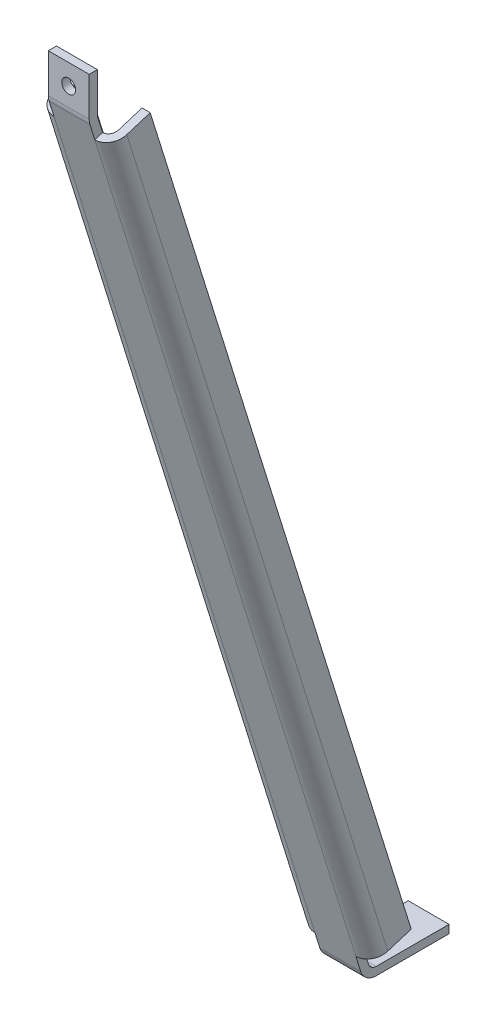
ISO-10303-21;
HEADER;
FILE_DESCRIPTION(('STEP AP214'),'2;1');
FILE_NAME('part.step','',(''),(''),'','','');
FILE_SCHEMA(('AUTOMOTIVE_DESIGN { 1 0 10303 214 1 1 1 1 }'));
ENDSEC;
DATA;
#1=APPLICATION_CONTEXT('core data for automotive mechanical design processes');
#2=APPLICATION_PROTOCOL_DEFINITION('international standard','automotive_design',2000,#1);
#3=PRODUCT_CONTEXT('',#1,'mechanical');
#4=PRODUCT('Part','Part','',(#3));
#5=PRODUCT_RELATED_PRODUCT_CATEGORY('part','',(#4));
#6=PRODUCT_DEFINITION_FORMATION('','',#4);
#7=PRODUCT_DEFINITION_CONTEXT('part definition',#1,'design');
#8=PRODUCT_DEFINITION('design','',#6,#7);
#9=PRODUCT_DEFINITION_SHAPE('','',#8);
#10=(LENGTH_UNIT() NAMED_UNIT(*) SI_UNIT(.MILLI.,.METRE.));
#11=(NAMED_UNIT(*) PLANE_ANGLE_UNIT() SI_UNIT($,.RADIAN.));
#12=(NAMED_UNIT(*) SI_UNIT($,.STERADIAN.) SOLID_ANGLE_UNIT());
#13=UNCERTAINTY_MEASURE_WITH_UNIT(LENGTH_MEASURE(1.E-05),#10,'distance_accuracy_value','');
#14=(GEOMETRIC_REPRESENTATION_CONTEXT(3) GLOBAL_UNCERTAINTY_ASSIGNED_CONTEXT((#13)) GLOBAL_UNIT_ASSIGNED_CONTEXT((#10,
#11,#12)) REPRESENTATION_CONTEXT('',''));
#15=CARTESIAN_POINT('',(0.,0.,0.));
#16=DIRECTION('',(0.,0.,1.));
#17=DIRECTION('',(1.,0.,0.));
#18=AXIS2_PLACEMENT_3D('',#15,#16,#17);
#19=CARTESIAN_POINT('',(195.,68.,39.7925903591226));
#20=DIRECTION('',(1.,0.,0.));
#21=DIRECTION('',(0.,0.,-1.));
#22=AXIS2_PLACEMENT_3D('',#19,#20,#21);
#23=PLANE('',#22);
#24=DIRECTION('',(0.,-0.954716716288455,-0.297516372052681));
#25=VECTOR('',#24,1.);
#26=CARTESIAN_POINT('',(195.,66.8099345117893,43.6114572242764));
#27=LINE('',#26,#25);
#28=CARTESIAN_POINT('',(195.,279.266547538485,109.818866865154));
#29=VERTEX_POINT('',#28);
#30=CARTESIAN_POINT('',(195.,275.447680673332,108.628801376943));
#31=VERTEX_POINT('',#30);
#32=EDGE_CURVE('E324',#29,#31,#27,.T.);
#33=ORIENTED_EDGE('',*,*,#32,.T.);
#34=DIRECTION('',(0.,0.297516372052681,-0.954716716288455));
#35=VECTOR('',#34,1.);
#36=CARTESIAN_POINT('',(195.,276.637746161542,104.809934511789));
#37=LINE('',#36,#35);
#38=CARTESIAN_POINT('',(195.,276.042713417437,106.719367944366));
#39=VERTEX_POINT('',#38);
#40=EDGE_CURVE('E11',#31,#39,#37,.T.);
#41=ORIENTED_EDGE('',*,*,#40,.T.);
#42=DIRECTION('',(0.,0.954716716288455,0.297516372052681));
#43=VECTOR('',#42,1.);
#44=CARTESIAN_POINT('',(195.,279.861580282591,107.909433432577));
#45=LINE('',#44,#43);
#46=CARTESIAN_POINT('',(195.,279.861580282591,107.909433432577));
#47=VERTEX_POINT('',#46);
#48=EDGE_CURVE('E313',#39,#47,#45,.T.);
#49=ORIENTED_EDGE('',*,*,#48,.T.);
#50=CARTESIAN_POINT('',(195.,280.456613026696,106.));
#51=DIRECTION('',(-1.,0.,0.));
#52=DIRECTION('',(0.,0.,-1.));
#53=AXIS2_PLACEMENT_3D('',#50,#51,#52);
#54=CIRCLE('',#53,1.99999999999999);
#55=CARTESIAN_POINT('',(195.,280.456613026696,108.));
#56=VERTEX_POINT('',#55);
#57=EDGE_CURVE('E314',#47,#56,#54,.T.);
#58=ORIENTED_EDGE('',*,*,#57,.T.);
#59=DIRECTION('',(0.,1.,0.));
#60=VECTOR('',#59,1.);
#61=CARTESIAN_POINT('',(195.,290.,108.));
#62=LINE('',#61,#60);
#63=CARTESIAN_POINT('',(195.,290.,108.));
#64=VERTEX_POINT('',#63);
#65=EDGE_CURVE('E316',#56,#64,#62,.T.);
#66=ORIENTED_EDGE('',*,*,#65,.T.);
#67=DIRECTION('',(0.,0.,1.));
#68=VECTOR('',#67,1.);
#69=CARTESIAN_POINT('',(195.,290.,110.));
#70=LINE('',#69,#68);
#71=CARTESIAN_POINT('',(195.,290.,110.));
#72=VERTEX_POINT('',#71);
#73=EDGE_CURVE('E318',#64,#72,#70,.T.);
#74=ORIENTED_EDGE('',*,*,#73,.T.);
#75=DIRECTION('',(0.,-1.,0.));
#76=VECTOR('',#75,1.);
#77=CARTESIAN_POINT('',(195.,280.456613026696,110.));
#78=LINE('',#77,#76);
#79=CARTESIAN_POINT('',(195.,280.456613026696,110.));
#80=VERTEX_POINT('',#79);
#81=EDGE_CURVE('E319',#72,#80,#78,.T.);
#82=ORIENTED_EDGE('',*,*,#81,.T.);
#83=CARTESIAN_POINT('',(195.,280.456613026696,106.));
#84=DIRECTION('',(1.,0.,0.));
#85=DIRECTION('',(0.,0.,-1.));
#86=AXIS2_PLACEMENT_3D('',#83,#84,#85);
#87=CIRCLE('',#86,4.);
#88=EDGE_CURVE('E325',#80,#29,#87,.T.);
#89=ORIENTED_EDGE('',*,*,#88,.T.);
#90=EDGE_LOOP('',(#33,#41,#49,#58,#66,#74,#82,#89));
#91=FACE_BOUND('',#90,.T.);
#92=ADVANCED_FACE('F41',(#91),#23,.T.);
#93=CARTESIAN_POINT('',(185.,68.,39.7925903591226));
#94=DIRECTION('',(1.,0.,0.));
#95=DIRECTION('',(0.,0.,-1.));
#96=AXIS2_PLACEMENT_3D('',#93,#94,#95);
#97=PLANE('',#96);
#98=DIRECTION('',(0.,0.297516372052681,-0.954716716288455));
#99=VECTOR('',#98,1.);
#100=CARTESIAN_POINT('',(185.,276.637746161542,104.809934511789));
#101=LINE('',#100,#99);
#102=CARTESIAN_POINT('',(185.,275.447680673332,108.628801376943));
#103=VERTEX_POINT('',#102);
#104=CARTESIAN_POINT('',(185.,276.042713417437,106.719367944366));
#105=VERTEX_POINT('',#104);
#106=EDGE_CURVE('E397',#103,#105,#101,.T.);
#107=ORIENTED_EDGE('',*,*,#106,.F.);
#108=DIRECTION('',(0.,-0.954716716288455,-0.297516372052681));
#109=VECTOR('',#108,1.);
#110=CARTESIAN_POINT('',(185.,66.8099345117893,43.6114572242764));
#111=LINE('',#110,#109);
#112=CARTESIAN_POINT('',(185.,279.266547538485,109.818866865154));
#113=VERTEX_POINT('',#112);
#114=EDGE_CURVE('E354',#113,#103,#111,.T.);
#115=ORIENTED_EDGE('',*,*,#114,.F.);
#116=CARTESIAN_POINT('',(185.,280.456613026696,106.));
#117=DIRECTION('',(1.,0.,0.));
#118=DIRECTION('',(0.,0.,-1.));
#119=AXIS2_PLACEMENT_3D('',#116,#117,#118);
#120=CIRCLE('',#119,4.);
#121=CARTESIAN_POINT('',(185.,280.456613026696,110.));
#122=VERTEX_POINT('',#121);
#123=EDGE_CURVE('E348',#122,#113,#120,.T.);
#124=ORIENTED_EDGE('',*,*,#123,.F.);
#125=DIRECTION('',(0.,-1.,0.));
#126=VECTOR('',#125,1.);
#127=CARTESIAN_POINT('',(185.,280.456613026696,110.));
#128=LINE('',#127,#126);
#129=CARTESIAN_POINT('',(185.,290.,110.));
#130=VERTEX_POINT('',#129);
#131=EDGE_CURVE('E346',#130,#122,#128,.T.);
#132=ORIENTED_EDGE('',*,*,#131,.F.);
#133=DIRECTION('',(0.,0.,1.));
#134=VECTOR('',#133,1.);
#135=CARTESIAN_POINT('',(185.,290.,110.));
#136=LINE('',#135,#134);
#137=CARTESIAN_POINT('',(185.,290.,108.));
#138=VERTEX_POINT('',#137);
#139=EDGE_CURVE('E347',#138,#130,#136,.T.);
#140=ORIENTED_EDGE('',*,*,#139,.F.);
#141=DIRECTION('',(0.,1.,0.));
#142=VECTOR('',#141,1.);
#143=CARTESIAN_POINT('',(185.,290.,108.));
#144=LINE('',#143,#142);
#145=CARTESIAN_POINT('',(185.,280.456613026696,108.));
#146=VERTEX_POINT('',#145);
#147=EDGE_CURVE('E343',#146,#138,#144,.T.);
#148=ORIENTED_EDGE('',*,*,#147,.F.);
#149=CARTESIAN_POINT('',(185.,280.456613026696,106.));
#150=DIRECTION('',(-1.,0.,0.));
#151=DIRECTION('',(0.,0.,-1.));
#152=AXIS2_PLACEMENT_3D('',#149,#150,#151);
#153=CIRCLE('',#152,1.99999999999999);
#154=CARTESIAN_POINT('',(185.,279.861580282591,107.909433432577));
#155=VERTEX_POINT('',#154);
#156=EDGE_CURVE('E342',#155,#146,#153,.T.);
#157=ORIENTED_EDGE('',*,*,#156,.F.);
#158=DIRECTION('',(0.,0.954716716288455,0.297516372052681));
#159=VECTOR('',#158,1.);
#160=CARTESIAN_POINT('',(185.,279.861580282591,107.909433432577));
#161=LINE('',#160,#159);
#162=EDGE_CURVE('E339',#105,#155,#161,.T.);
#163=ORIENTED_EDGE('',*,*,#162,.F.);
#164=EDGE_LOOP('',(#107,#115,#124,#132,#140,#148,#157,#163));
#165=FACE_BOUND('',#164,.T.);
#166=ADVANCED_FACE('F437',(#165),#97,.F.);
#167=CARTESIAN_POINT('',(195.,66.,22.));
#168=DIRECTION('',(0.,0.,1.));
#169=DIRECTION('',(1.,0.,0.));
#170=AXIS2_PLACEMENT_3D('',#167,#168,#169);
#171=PLANE('',#170);
#172=DIRECTION('',(0.,1.,0.));
#173=VECTOR('',#172,1.);
#174=CARTESIAN_POINT('',(185.,66.,22.));
#175=LINE('',#174,#173);
#176=CARTESIAN_POINT('',(185.,64.,22.));
#177=VERTEX_POINT('',#176);
#178=CARTESIAN_POINT('',(185.,66.,22.));
#179=VERTEX_POINT('',#178);
#180=EDGE_CURVE('E251',#177,#179,#175,.T.);
#181=ORIENTED_EDGE('',*,*,#180,.T.);
#182=DIRECTION('',(-1.,0.,0.));
#183=VECTOR('',#182,1.);
#184=CARTESIAN_POINT('',(195.,66.,22.));
#185=LINE('',#184,#183);
#186=CARTESIAN_POINT('',(195.,66.,22.));
#187=VERTEX_POINT('',#186);
#188=EDGE_CURVE('E391',#187,#179,#185,.T.);
#189=ORIENTED_EDGE('',*,*,#188,.F.);
#190=DIRECTION('',(0.,1.,0.));
#191=VECTOR('',#190,1.);
#192=CARTESIAN_POINT('',(195.,66.,22.));
#193=LINE('',#192,#191);
#194=CARTESIAN_POINT('',(195.,64.,22.));
#195=VERTEX_POINT('',#194);
#196=EDGE_CURVE('E304',#195,#187,#193,.T.);
#197=ORIENTED_EDGE('',*,*,#196,.F.);
#198=DIRECTION('',(-1.,0.,0.));
#199=VECTOR('',#198,1.);
#200=CARTESIAN_POINT('',(195.,64.,22.));
#201=LINE('',#200,#199);
#202=EDGE_CURVE('E332',#195,#177,#201,.T.);
#203=ORIENTED_EDGE('',*,*,#202,.T.);
#204=EDGE_LOOP('',(#181,#189,#197,#203));
#205=FACE_BOUND('',#204,.T.);
#206=ADVANCED_FACE('F43',(#205),#171,.F.);
#207=CARTESIAN_POINT('',(195.,66.,39.7925903591226));
#208=DIRECTION('',(0.,-1.,0.));
#209=DIRECTION('',(0.,0.,-1.));
#210=AXIS2_PLACEMENT_3D('',#207,#208,#209);
#211=PLANE('',#210);
#212=CARTESIAN_POINT('',(190.,66.,29.));
#213=DIRECTION('',(0.,-1.,0.));
#214=DIRECTION('',(0.,0.,-1.));
#215=AXIS2_PLACEMENT_3D('',#212,#213,#214);
#216=CIRCLE('',#215,1.70000000000001);
#217=CARTESIAN_POINT('',(190.,66.,27.3));
#218=VERTEX_POINT('',#217);
#219=EDGE_CURVE('E233',#218,#218,#216,.T.);
#220=ORIENTED_EDGE('',*,*,#219,.T.);
#221=EDGE_LOOP('',(#220));
#222=FACE_BOUND('',#221,.T.);
#223=CARTESIAN_POINT('',(190.,66.,36.));
#224=DIRECTION('',(0.,-1.,0.));
#225=DIRECTION('',(0.,0.,-1.));
#226=AXIS2_PLACEMENT_3D('',#223,#224,#225);
#227=CIRCLE('',#226,1.70000000000001);
#228=CARTESIAN_POINT('',(190.,66.,34.3));
#229=VERTEX_POINT('',#228);
#230=EDGE_CURVE('E405',#229,#229,#227,.T.);
#231=ORIENTED_EDGE('',*,*,#230,.T.);
#232=EDGE_LOOP('',(#231));
#233=FACE_BOUND('',#232,.T.);
#234=DIRECTION('',(0.,0.,1.));
#235=VECTOR('',#234,1.);
#236=CARTESIAN_POINT('',(185.,66.,39.7925903591226));
#237=LINE('',#236,#235);
#238=CARTESIAN_POINT('',(185.,66.,39.7925903591226));
#239=VERTEX_POINT('',#238);
#240=EDGE_CURVE('E331',#179,#239,#237,.T.);
#241=ORIENTED_EDGE('',*,*,#240,.T.);
#242=DIRECTION('',(-1.,0.,0.));
#243=VECTOR('',#242,1.);
#244=CARTESIAN_POINT('',(195.,66.,39.7925903591226));
#245=LINE('',#244,#243);
#246=CARTESIAN_POINT('',(195.,66.,39.7925903591226));
#247=VERTEX_POINT('',#246);
#248=EDGE_CURVE('E389',#247,#239,#245,.T.);
#249=ORIENTED_EDGE('',*,*,#248,.F.);
#250=DIRECTION('',(0.,0.,1.));
#251=VECTOR('',#250,1.);
#252=CARTESIAN_POINT('',(195.,66.,39.7925903591226));
#253=LINE('',#252,#251);
#254=EDGE_CURVE('E308',#187,#247,#253,.T.);
#255=ORIENTED_EDGE('',*,*,#254,.F.);
#256=ORIENTED_EDGE('',*,*,#188,.T.);
#257=EDGE_LOOP('',(#241,#249,#255,#256));
#258=FACE_BOUND('',#257,.T.);
#259=ADVANCED_FACE('F527',(#222,#233,#258),#211,.F.);
#260=CARTESIAN_POINT('',(195.,68.,39.7925903591226));
#261=DIRECTION('',(-1.,0.,0.));
#262=DIRECTION('',(0.,0.,1.));
#263=AXIS2_PLACEMENT_3D('',#260,#261,#262);
#264=CYLINDRICAL_SURFACE('',#263,2.);
#265=CARTESIAN_POINT('',(185.,68.,39.7925903591226));
#266=DIRECTION('',(-1.,0.,0.));
#267=DIRECTION('',(0.,0.,-1.));
#268=AXIS2_PLACEMENT_3D('',#265,#266,#267);
#269=CIRCLE('',#268,2.);
#270=CARTESIAN_POINT('',(185.,67.4049672558946,41.7020237916995));
#271=VERTEX_POINT('',#270);
#272=EDGE_CURVE('E336',#239,#271,#269,.T.);
#273=ORIENTED_EDGE('',*,*,#272,.T.);
#274=DIRECTION('',(-1.,0.,0.));
#275=VECTOR('',#274,1.);
#276=CARTESIAN_POINT('',(195.,67.4049672558946,41.7020237916995));
#277=LINE('',#276,#275);
#278=CARTESIAN_POINT('',(195.,67.4049672558946,41.7020237916995));
#279=VERTEX_POINT('',#278);
#280=EDGE_CURVE('E384',#279,#271,#277,.T.);
#281=ORIENTED_EDGE('',*,*,#280,.F.);
#282=CARTESIAN_POINT('',(195.,68.,39.7925903591226));
#283=DIRECTION('',(-1.,0.,0.));
#284=DIRECTION('',(0.,0.,-1.));
#285=AXIS2_PLACEMENT_3D('',#282,#283,#284);
#286=CIRCLE('',#285,2.);
#287=EDGE_CURVE('E310',#247,#279,#286,.T.);
#288=ORIENTED_EDGE('',*,*,#287,.F.);
#289=ORIENTED_EDGE('',*,*,#248,.T.);
#290=EDGE_LOOP('',(#273,#281,#288,#289));
#291=FACE_BOUND('',#290,.T.);
#292=ADVANCED_FACE('F525',(#291),#264,.F.);
#293=CARTESIAN_POINT('',(195.,279.861580282591,107.909433432577));
#294=DIRECTION('',(0.,-0.297516372052681,0.954716716288455));
#295=DIRECTION('',(0.,-0.954716716288455,-0.297516372052681));
#296=AXIS2_PLACEMENT_3D('',#293,#294,#295);
#297=PLANE('',#296);
#298=ORIENTED_EDGE('',*,*,#48,.F.);
#299=DIRECTION('',(0.,-0.954716716288455,-0.297516372052681));
#300=VECTOR('',#299,1.);
#301=CARTESIAN_POINT('',(195.,276.042713417437,106.719367944366));
#302=LINE('',#301,#300);
#303=CARTESIAN_POINT('',(195.,71.2238341210485,42.8920892799102));
#304=VERTEX_POINT('',#303);
#305=EDGE_CURVE('E262',#39,#304,#302,.T.);
#306=ORIENTED_EDGE('',*,*,#305,.T.);
#307=EDGE_CURVE('E315',#279,#304,#45,.T.);
#308=ORIENTED_EDGE('',*,*,#307,.F.);
#309=ORIENTED_EDGE('',*,*,#280,.T.);
#310=CARTESIAN_POINT('',(185.,71.2238341210484,42.8920892799102));
#311=VERTEX_POINT('',#310);
#312=EDGE_CURVE('E338',#271,#311,#161,.T.);
#313=ORIENTED_EDGE('',*,*,#312,.T.);
#314=DIRECTION('',(0.,-0.954716716288455,-0.297516372052681));
#315=VECTOR('',#314,1.);
#316=CARTESIAN_POINT('',(185.,276.042713417437,106.719367944366));
#317=LINE('',#316,#315);
#318=EDGE_CURVE('E255',#105,#311,#317,.T.);
#319=ORIENTED_EDGE('',*,*,#318,.F.);
#320=ORIENTED_EDGE('',*,*,#162,.T.);
#321=DIRECTION('',(-1.,0.,0.));
#322=VECTOR('',#321,1.);
#323=CARTESIAN_POINT('',(195.,279.861580282591,107.909433432577));
#324=LINE('',#323,#322);
#325=EDGE_CURVE('E385',#47,#155,#324,.T.);
#326=ORIENTED_EDGE('',*,*,#325,.F.);
#327=EDGE_LOOP('',(#298,#306,#308,#309,#313,#319,#320,#326));
#328=FACE_BOUND('',#327,.T.);
#329=ADVANCED_FACE('F469',(#328),#297,.F.);
#330=CARTESIAN_POINT('',(195.,280.456613026696,106.));
#331=DIRECTION('',(-1.,0.,0.));
#332=DIRECTION('',(0.,0.,1.));
#333=AXIS2_PLACEMENT_3D('',#330,#331,#332);
#334=CYLINDRICAL_SURFACE('',#333,1.99999999999999);
#335=ORIENTED_EDGE('',*,*,#156,.T.);
#336=DIRECTION('',(-1.,0.,0.));
#337=VECTOR('',#336,1.);
#338=CARTESIAN_POINT('',(195.,280.456613026696,108.));
#339=LINE('',#338,#337);
#340=EDGE_CURVE('E377',#56,#146,#339,.T.);
#341=ORIENTED_EDGE('',*,*,#340,.F.);
#342=ORIENTED_EDGE('',*,*,#57,.F.);
#343=ORIENTED_EDGE('',*,*,#325,.T.);
#344=EDGE_LOOP('',(#335,#341,#342,#343));
#345=FACE_BOUND('',#344,.T.);
#346=ADVANCED_FACE('F519',(#345),#334,.F.);
#347=CARTESIAN_POINT('',(195.,290.,108.));
#348=DIRECTION('',(0.,0.,1.));
#349=DIRECTION('',(1.,0.,0.));
#350=AXIS2_PLACEMENT_3D('',#347,#348,#349);
#351=PLANE('',#350);
#352=CARTESIAN_POINT('',(190.,285.,108.));
#353=DIRECTION('',(0.,0.,1.));
#354=DIRECTION('',(1.,0.,0.));
#355=AXIS2_PLACEMENT_3D('',#352,#353,#354);
#356=CIRCLE('',#355,1.70000000000001);
#357=CARTESIAN_POINT('',(191.7,285.,108.));
#358=VERTEX_POINT('',#357);
#359=EDGE_CURVE('E401',#358,#358,#356,.F.);
#360=ORIENTED_EDGE('',*,*,#359,.F.);
#361=EDGE_LOOP('',(#360));
#362=FACE_BOUND('',#361,.T.);
#363=ORIENTED_EDGE('',*,*,#147,.T.);
#364=DIRECTION('',(-1.,0.,0.));
#365=VECTOR('',#364,1.);
#366=CARTESIAN_POINT('',(195.,290.,108.));
#367=LINE('',#366,#365);
#368=EDGE_CURVE('E376',#64,#138,#367,.T.);
#369=ORIENTED_EDGE('',*,*,#368,.F.);
#370=ORIENTED_EDGE('',*,*,#65,.F.);
#371=ORIENTED_EDGE('',*,*,#340,.T.);
#372=EDGE_LOOP('',(#363,#369,#370,#371));
#373=FACE_BOUND('',#372,.T.);
#374=ADVANCED_FACE('F514',(#362,#373),#351,.F.);
#375=CARTESIAN_POINT('',(195.,290.,110.));
#376=DIRECTION('',(0.,-1.,0.));
#377=DIRECTION('',(0.,0.,-1.));
#378=AXIS2_PLACEMENT_3D('',#375,#376,#377);
#379=PLANE('',#378);
#380=ORIENTED_EDGE('',*,*,#139,.T.);
#381=DIRECTION('',(-1.,0.,0.));
#382=VECTOR('',#381,1.);
#383=CARTESIAN_POINT('',(195.,290.,110.));
#384=LINE('',#383,#382);
#385=EDGE_CURVE('E373',#72,#130,#384,.T.);
#386=ORIENTED_EDGE('',*,*,#385,.F.);
#387=ORIENTED_EDGE('',*,*,#73,.F.);
#388=ORIENTED_EDGE('',*,*,#368,.T.);
#389=EDGE_LOOP('',(#380,#386,#387,#388));
#390=FACE_BOUND('',#389,.T.);
#391=ADVANCED_FACE('F422',(#390),#379,.F.);
#392=CARTESIAN_POINT('',(195.,280.456613026696,110.));
#393=DIRECTION('',(0.,0.,-1.));
#394=DIRECTION('',(-1.,0.,0.));
#395=AXIS2_PLACEMENT_3D('',#392,#393,#394);
#396=PLANE('',#395);
#397=CARTESIAN_POINT('',(190.,285.,110.));
#398=DIRECTION('',(0.,0.,-1.));
#399=DIRECTION('',(-1.,0.,0.));
#400=AXIS2_PLACEMENT_3D('',#397,#398,#399);
#401=CIRCLE('',#400,1.70000000000001);
#402=CARTESIAN_POINT('',(188.3,285.,110.));
#403=VERTEX_POINT('',#402);
#404=EDGE_CURVE('E44',#403,#403,#401,.F.);
#405=ORIENTED_EDGE('',*,*,#404,.F.);
#406=EDGE_LOOP('',(#405));
#407=FACE_BOUND('',#406,.T.);
#408=ORIENTED_EDGE('',*,*,#131,.T.);
#409=DIRECTION('',(-1.,0.,0.));
#410=VECTOR('',#409,1.);
#411=CARTESIAN_POINT('',(195.,280.456613026696,110.));
#412=LINE('',#411,#410);
#413=EDGE_CURVE('E367',#80,#122,#412,.T.);
#414=ORIENTED_EDGE('',*,*,#413,.F.);
#415=ORIENTED_EDGE('',*,*,#81,.F.);
#416=ORIENTED_EDGE('',*,*,#385,.T.);
#417=EDGE_LOOP('',(#408,#414,#415,#416));
#418=FACE_BOUND('',#417,.T.);
#419=ADVANCED_FACE('F423',(#407,#418),#396,.F.);
#420=CARTESIAN_POINT('',(195.,280.456613026696,106.));
#421=DIRECTION('',(-1.,0.,0.));
#422=DIRECTION('',(0.,0.,1.));
#423=AXIS2_PLACEMENT_3D('',#420,#421,#422);
#424=CYLINDRICAL_SURFACE('',#423,4.);
#425=ORIENTED_EDGE('',*,*,#123,.T.);
#426=DIRECTION('',(-1.,0.,0.));
#427=VECTOR('',#426,1.);
#428=CARTESIAN_POINT('',(195.,279.266547538485,109.818866865154));
#429=LINE('',#428,#427);
#430=EDGE_CURVE('E370',#29,#113,#429,.T.);
#431=ORIENTED_EDGE('',*,*,#430,.F.);
#432=ORIENTED_EDGE('',*,*,#88,.F.);
#433=ORIENTED_EDGE('',*,*,#413,.T.);
#434=EDGE_LOOP('',(#425,#431,#432,#433));
#435=FACE_BOUND('',#434,.T.);
#436=ADVANCED_FACE('F424',(#435),#424,.T.);
#437=CARTESIAN_POINT('',(195.,66.8099345117893,43.6114572242764));
#438=DIRECTION('',(0.,0.297516372052681,-0.954716716288455));
#439=DIRECTION('',(0.,0.954716716288455,0.297516372052681));
#440=AXIS2_PLACEMENT_3D('',#437,#438,#439);
#441=PLANE('',#440);
#442=DIRECTION('',(0.,-0.954716716288455,-0.297516372052681));
#443=VECTOR('',#442,1.);
#444=CARTESIAN_POINT('',(185.,275.447680673332,108.628801376943));
#445=LINE('',#444,#443);
#446=CARTESIAN_POINT('',(185.,70.6288013769431,44.8015227124871));
#447=VERTEX_POINT('',#446);
#448=EDGE_CURVE('E229',#103,#447,#445,.T.);
#449=ORIENTED_EDGE('',*,*,#448,.T.);
#450=CARTESIAN_POINT('',(185.,66.8099345117893,43.6114572242764));
#451=VERTEX_POINT('',#450);
#452=EDGE_CURVE('E352',#447,#451,#111,.T.);
#453=ORIENTED_EDGE('',*,*,#452,.T.);
#454=DIRECTION('',(-1.,0.,0.));
#455=VECTOR('',#454,1.);
#456=CARTESIAN_POINT('',(195.,66.8099345117893,43.6114572242764));
#457=LINE('',#456,#455);
#458=CARTESIAN_POINT('',(195.,66.8099345117893,43.6114572242764));
#459=VERTEX_POINT('',#458);
#460=EDGE_CURVE('E365',#459,#451,#457,.T.);
#461=ORIENTED_EDGE('',*,*,#460,.F.);
#462=CARTESIAN_POINT('',(195.,70.6288013769431,44.8015227124871));
#463=VERTEX_POINT('',#462);
#464=EDGE_CURVE('E322',#463,#459,#27,.T.);
#465=ORIENTED_EDGE('',*,*,#464,.F.);
#466=DIRECTION('',(0.,-0.954716716288455,-0.297516372052681));
#467=VECTOR('',#466,1.);
#468=CARTESIAN_POINT('',(195.,275.447680673332,108.628801376943));
#469=LINE('',#468,#467);
#470=EDGE_CURVE('E63',#31,#463,#469,.T.);
#471=ORIENTED_EDGE('',*,*,#470,.F.);
#472=ORIENTED_EDGE('',*,*,#32,.F.);
#473=ORIENTED_EDGE('',*,*,#430,.T.);
#474=ORIENTED_EDGE('',*,*,#114,.T.);
#475=EDGE_LOOP('',(#449,#453,#461,#465,#471,#472,#473,#474));
#476=FACE_BOUND('',#475,.T.);
#477=ADVANCED_FACE('F439',(#476),#441,.F.);
#478=CARTESIAN_POINT('',(195.,68.,39.7925903591226));
#479=DIRECTION('',(-1.,0.,0.));
#480=DIRECTION('',(0.,0.,1.));
#481=AXIS2_PLACEMENT_3D('',#478,#479,#480);
#482=CYLINDRICAL_SURFACE('',#481,4.);
#483=CARTESIAN_POINT('',(185.,68.,39.7925903591226));
#484=DIRECTION('',(1.,0.,0.));
#485=DIRECTION('',(0.,0.,-1.));
#486=AXIS2_PLACEMENT_3D('',#483,#484,#485);
#487=CIRCLE('',#486,4.);
#488=CARTESIAN_POINT('',(185.,64.,39.7925903591226));
#489=VERTEX_POINT('',#488);
#490=EDGE_CURVE('E356',#451,#489,#487,.T.);
#491=ORIENTED_EDGE('',*,*,#490,.T.);
#492=DIRECTION('',(-1.,0.,0.));
#493=VECTOR('',#492,1.);
#494=CARTESIAN_POINT('',(195.,64.,39.7925903591226));
#495=LINE('',#494,#493);
#496=CARTESIAN_POINT('',(195.,64.,39.7925903591226));
#497=VERTEX_POINT('',#496);
#498=EDGE_CURVE('E363',#497,#489,#495,.T.);
#499=ORIENTED_EDGE('',*,*,#498,.F.);
#500=CARTESIAN_POINT('',(195.,68.,39.7925903591226));
#501=DIRECTION('',(1.,0.,0.));
#502=DIRECTION('',(0.,0.,-1.));
#503=AXIS2_PLACEMENT_3D('',#500,#501,#502);
#504=CIRCLE('',#503,4.);
#505=EDGE_CURVE('E330',#459,#497,#504,.T.);
#506=ORIENTED_EDGE('',*,*,#505,.F.);
#507=ORIENTED_EDGE('',*,*,#460,.T.);
#508=EDGE_LOOP('',(#491,#499,#506,#507));
#509=FACE_BOUND('',#508,.T.);
#510=ADVANCED_FACE('F496',(#509),#482,.T.);
#511=CARTESIAN_POINT('',(195.,64.,22.));
#512=DIRECTION('',(0.,1.,0.));
#513=DIRECTION('',(0.,0.,1.));
#514=AXIS2_PLACEMENT_3D('',#511,#512,#513);
#515=PLANE('',#514);
#516=CARTESIAN_POINT('',(190.,64.,29.));
#517=DIRECTION('',(0.,1.,0.));
#518=DIRECTION('',(0.,0.,1.));
#519=AXIS2_PLACEMENT_3D('',#516,#517,#518);
#520=CIRCLE('',#519,1.70000000000001);
#521=CARTESIAN_POINT('',(190.,64.,30.7));
#522=VERTEX_POINT('',#521);
#523=EDGE_CURVE('E404',#522,#522,#520,.T.);
#524=ORIENTED_EDGE('',*,*,#523,.T.);
#525=EDGE_LOOP('',(#524));
#526=FACE_BOUND('',#525,.T.);
#527=CARTESIAN_POINT('',(190.,64.,36.));
#528=DIRECTION('',(0.,1.,0.));
#529=DIRECTION('',(0.,0.,1.));
#530=AXIS2_PLACEMENT_3D('',#527,#528,#529);
#531=CIRCLE('',#530,1.70000000000001);
#532=CARTESIAN_POINT('',(190.,64.,37.7));
#533=VERTEX_POINT('',#532);
#534=EDGE_CURVE('E400',#533,#533,#531,.T.);
#535=ORIENTED_EDGE('',*,*,#534,.T.);
#536=EDGE_LOOP('',(#535));
#537=FACE_BOUND('',#536,.T.);
#538=DIRECTION('',(0.,0.,-1.));
#539=VECTOR('',#538,1.);
#540=CARTESIAN_POINT('',(185.,64.,22.));
#541=LINE('',#540,#539);
#542=EDGE_CURVE('E307',#489,#177,#541,.T.);
#543=ORIENTED_EDGE('',*,*,#542,.T.);
#544=ORIENTED_EDGE('',*,*,#202,.F.);
#545=DIRECTION('',(0.,0.,-1.));
#546=VECTOR('',#545,1.);
#547=CARTESIAN_POINT('',(195.,64.,22.));
#548=LINE('',#547,#546);
#549=EDGE_CURVE('E328',#497,#195,#548,.T.);
#550=ORIENTED_EDGE('',*,*,#549,.F.);
#551=ORIENTED_EDGE('',*,*,#498,.T.);
#552=EDGE_LOOP('',(#543,#544,#550,#551));
#553=FACE_BOUND('',#552,.T.);
#554=ADVANCED_FACE('F495',(#526,#537,#553),#515,.F.);
#555=DIRECTION('',(0.,0.297516372052681,-0.954716716288455));
#556=VECTOR('',#555,1.);
#557=CARTESIAN_POINT('',(195.,71.8188668651538,40.9826558473333));
#558=LINE('',#557,#556);
#559=EDGE_CURVE('E49',#463,#304,#558,.T.);
#560=ORIENTED_EDGE('',*,*,#559,.F.);
#561=ORIENTED_EDGE('',*,*,#464,.T.);
#562=ORIENTED_EDGE('',*,*,#505,.T.);
#563=ORIENTED_EDGE('',*,*,#549,.T.);
#564=ORIENTED_EDGE('',*,*,#196,.T.);
#565=ORIENTED_EDGE('',*,*,#254,.T.);
#566=ORIENTED_EDGE('',*,*,#287,.T.);
#567=ORIENTED_EDGE('',*,*,#307,.T.);
#568=EDGE_LOOP('',(#560,#561,#562,#563,#564,#565,#566,#567));
#569=FACE_BOUND('',#568,.T.);
#570=ADVANCED_FACE('F483',(#569),#23,.T.);
#571=ORIENTED_EDGE('',*,*,#452,.F.);
#572=DIRECTION('',(0.,0.297516372052681,-0.954716716288455));
#573=VECTOR('',#572,1.);
#574=CARTESIAN_POINT('',(185.,71.8188668651538,40.9826558473333));
#575=LINE('',#574,#573);
#576=EDGE_CURVE('E393',#447,#311,#575,.T.);
#577=ORIENTED_EDGE('',*,*,#576,.T.);
#578=ORIENTED_EDGE('',*,*,#312,.F.);
#579=ORIENTED_EDGE('',*,*,#272,.F.);
#580=ORIENTED_EDGE('',*,*,#240,.F.);
#581=ORIENTED_EDGE('',*,*,#180,.F.);
#582=ORIENTED_EDGE('',*,*,#542,.F.);
#583=ORIENTED_EDGE('',*,*,#490,.F.);
#584=EDGE_LOOP('',(#571,#577,#578,#579,#580,#581,#582,#583));
#585=FACE_BOUND('',#584,.T.);
#586=ADVANCED_FACE('F487',(#585),#97,.F.);
#587=CARTESIAN_POINT('',(185.,276.637746161542,104.809934511789));
#588=DIRECTION('',(0.,-0.954716716288455,-0.297516372052681));
#589=DIRECTION('',(0.,0.297516372052681,-0.954716716288455));
#590=AXIS2_PLACEMENT_3D('',#587,#588,#589);
#591=PLANE('',#590);
#592=CARTESIAN_POINT('',(185.,276.637746161542,104.809934511789));
#593=DIRECTION('',(0.,-0.954716716288455,-0.297516372052681));
#594=DIRECTION('',(0.,0.297516372052681,-0.954716716288455));
#595=AXIS2_PLACEMENT_3D('',#592,#593,#594);
#596=CIRCLE('',#595,4.);
#597=CARTESIAN_POINT('',(181.,276.637746161542,104.809934511789));
#598=VERTEX_POINT('',#597);
#599=EDGE_CURVE('E219',#103,#598,#596,.T.);
#600=ORIENTED_EDGE('',*,*,#599,.F.);
#601=ORIENTED_EDGE('',*,*,#106,.T.);
#602=CARTESIAN_POINT('',(185.,276.637746161542,104.809934511789));
#603=DIRECTION('',(0.,0.954716716288455,0.297516372052681));
#604=DIRECTION('',(0.,0.297516372052681,-0.954716716288455));
#605=AXIS2_PLACEMENT_3D('',#602,#603,#604);
#606=CIRCLE('',#605,2.);
#607=CARTESIAN_POINT('',(183.,276.637746161542,104.809934511789));
#608=VERTEX_POINT('',#607);
#609=EDGE_CURVE('E212',#608,#105,#606,.T.);
#610=ORIENTED_EDGE('',*,*,#609,.F.);
#611=DIRECTION('',(0.,-0.29751637205268,0.954716716288456));
#612=VECTOR('',#611,1.);
#613=CARTESIAN_POINT('',(183.,278.422844393858,99.0816342140585));
#614=LINE('',#613,#612);
#615=CARTESIAN_POINT('',(183.,278.422844393858,99.0816342140585));
#616=VERTEX_POINT('',#615);
#617=EDGE_CURVE('E236',#616,#608,#614,.T.);
#618=ORIENTED_EDGE('',*,*,#617,.F.);
#619=DIRECTION('',(1.,0.,0.));
#620=VECTOR('',#619,1.);
#621=CARTESIAN_POINT('',(181.,278.422844393858,99.0816342140585));
#622=LINE('',#621,#620);
#623=CARTESIAN_POINT('',(181.,278.422844393858,99.0816342140585));
#624=VERTEX_POINT('',#623);
#625=EDGE_CURVE('E221',#624,#616,#622,.T.);
#626=ORIENTED_EDGE('',*,*,#625,.F.);
#627=DIRECTION('',(0.,0.29751637205268,-0.954716716288456));
#628=VECTOR('',#627,1.);
#629=CARTESIAN_POINT('',(181.,276.637746161542,104.809934511789));
#630=LINE('',#629,#628);
#631=EDGE_CURVE('E206',#598,#624,#630,.T.);
#632=ORIENTED_EDGE('',*,*,#631,.F.);
#633=EDGE_LOOP('',(#600,#601,#610,#618,#626,#632));
#634=FACE_BOUND('',#633,.T.);
#635=ADVANCED_FACE('F218',(#634),#591,.F.);
#636=CARTESIAN_POINT('',(185.,71.8188668651538,40.9826558473333));
#637=DIRECTION('',(0.,-0.954716716288455,-0.297516372052681));
#638=DIRECTION('',(0.,0.297516372052681,-0.954716716288455));
#639=AXIS2_PLACEMENT_3D('',#636,#637,#638);
#640=PLANE('',#639);
#641=ORIENTED_EDGE('',*,*,#576,.F.);
#642=CARTESIAN_POINT('',(185.,71.8188668651538,40.9826558473333));
#643=DIRECTION('',(0.,-0.954716716288455,-0.297516372052681));
#644=DIRECTION('',(0.,0.297516372052681,-0.954716716288455));
#645=AXIS2_PLACEMENT_3D('',#642,#643,#644);
#646=CIRCLE('',#645,4.);
#647=CARTESIAN_POINT('',(181.,71.8188668651538,40.9826558473333));
#648=VERTEX_POINT('',#647);
#649=EDGE_CURVE('E244',#447,#648,#646,.T.);
#650=ORIENTED_EDGE('',*,*,#649,.T.);
#651=DIRECTION('',(0.,0.29751637205268,-0.954716716288456));
#652=VECTOR('',#651,1.);
#653=CARTESIAN_POINT('',(181.,71.8188668651538,40.9826558473333));
#654=LINE('',#653,#652);
#655=CARTESIAN_POINT('',(181.,73.6039650974699,35.2543555496026));
#656=VERTEX_POINT('',#655);
#657=EDGE_CURVE('E208',#648,#656,#654,.T.);
#658=ORIENTED_EDGE('',*,*,#657,.T.);
#659=DIRECTION('',(1.,0.,0.));
#660=VECTOR('',#659,1.);
#661=CARTESIAN_POINT('',(181.,73.6039650974699,35.2543555496026));
#662=LINE('',#661,#660);
#663=CARTESIAN_POINT('',(183.,73.6039650974699,35.2543555496026));
#664=VERTEX_POINT('',#663);
#665=EDGE_CURVE('E247',#656,#664,#662,.T.);
#666=ORIENTED_EDGE('',*,*,#665,.T.);
#667=DIRECTION('',(0.,-0.29751637205268,0.954716716288456));
#668=VECTOR('',#667,1.);
#669=CARTESIAN_POINT('',(183.,73.6039650974699,35.2543555496026));
#670=LINE('',#669,#668);
#671=CARTESIAN_POINT('',(183.,71.8188668651538,40.9826558473333));
#672=VERTEX_POINT('',#671);
#673=EDGE_CURVE('E231',#664,#672,#670,.T.);
#674=ORIENTED_EDGE('',*,*,#673,.T.);
#675=CARTESIAN_POINT('',(185.,71.8188668651538,40.9826558473333));
#676=DIRECTION('',(0.,0.954716716288455,0.297516372052681));
#677=DIRECTION('',(0.,0.297516372052681,-0.954716716288455));
#678=AXIS2_PLACEMENT_3D('',#675,#676,#677);
#679=CIRCLE('',#678,2.);
#680=EDGE_CURVE('E228',#672,#311,#679,.T.);
#681=ORIENTED_EDGE('',*,*,#680,.T.);
#682=EDGE_LOOP('',(#641,#650,#658,#666,#674,#681));
#683=FACE_BOUND('',#682,.T.);
#684=ADVANCED_FACE('F565',(#683),#640,.T.);
#685=CARTESIAN_POINT('',(185.,276.637746161542,104.809934511789));
#686=DIRECTION('',(0.,-0.954716716288455,-0.297516372052681));
#687=DIRECTION('',(0.,0.297516372052681,-0.954716716288455));
#688=AXIS2_PLACEMENT_3D('',#685,#686,#687);
#689=CYLINDRICAL_SURFACE('',#688,4.);
#690=ORIENTED_EDGE('',*,*,#649,.F.);
#691=ORIENTED_EDGE('',*,*,#448,.F.);
#692=ORIENTED_EDGE('',*,*,#599,.T.);
#693=DIRECTION('',(0.,-0.954716716288455,-0.297516372052681));
#694=VECTOR('',#693,1.);
#695=CARTESIAN_POINT('',(181.,276.637746161542,104.809934511789));
#696=LINE('',#695,#694);
#697=EDGE_CURVE('E201',#598,#648,#696,.T.);
#698=ORIENTED_EDGE('',*,*,#697,.T.);
#699=EDGE_LOOP('',(#690,#691,#692,#698));
#700=FACE_BOUND('',#699,.T.);
#701=ADVANCED_FACE('F226',(#700),#689,.T.);
#702=CARTESIAN_POINT('',(185.,276.637746161542,104.809934511789));
#703=DIRECTION('',(0.,-0.954716716288455,-0.297516372052681));
#704=DIRECTION('',(0.,0.297516372052681,-0.954716716288455));
#705=AXIS2_PLACEMENT_3D('',#702,#703,#704);
#706=CYLINDRICAL_SURFACE('',#705,2.);
#707=ORIENTED_EDGE('',*,*,#680,.F.);
#708=DIRECTION('',(0.,-0.954716716288455,-0.297516372052681));
#709=VECTOR('',#708,1.);
#710=CARTESIAN_POINT('',(183.,276.637746161542,104.809934511789));
#711=LINE('',#710,#709);
#712=EDGE_CURVE('E260',#608,#672,#711,.T.);
#713=ORIENTED_EDGE('',*,*,#712,.F.);
#714=ORIENTED_EDGE('',*,*,#609,.T.);
#715=ORIENTED_EDGE('',*,*,#318,.T.);
#716=EDGE_LOOP('',(#707,#713,#714,#715));
#717=FACE_BOUND('',#716,.T.);
#718=ADVANCED_FACE('F547',(#717),#706,.F.);
#719=CARTESIAN_POINT('',(183.,278.422844393858,99.0816342140585));
#720=DIRECTION('',(1.,0.,0.));
#721=DIRECTION('',(0.,0.,-1.));
#722=AXIS2_PLACEMENT_3D('',#719,#720,#721);
#723=PLANE('',#722);
#724=ORIENTED_EDGE('',*,*,#673,.F.);
#725=DIRECTION('',(0.,-0.954716716288455,-0.297516372052681));
#726=VECTOR('',#725,1.);
#727=CARTESIAN_POINT('',(183.,278.422844393858,99.0816342140585));
#728=LINE('',#727,#726);
#729=EDGE_CURVE('E259',#616,#664,#728,.T.);
#730=ORIENTED_EDGE('',*,*,#729,.F.);
#731=ORIENTED_EDGE('',*,*,#617,.T.);
#732=ORIENTED_EDGE('',*,*,#712,.T.);
#733=EDGE_LOOP('',(#724,#730,#731,#732));
#734=FACE_BOUND('',#733,.T.);
#735=ADVANCED_FACE('F560',(#734),#723,.T.);
#736=CARTESIAN_POINT('',(181.,278.422844393858,99.0816342140585));
#737=DIRECTION('',(0.,0.297516372052681,-0.954716716288455));
#738=DIRECTION('',(0.,0.954716716288455,0.297516372052681));
#739=AXIS2_PLACEMENT_3D('',#736,#737,#738);
#740=PLANE('',#739);
#741=ORIENTED_EDGE('',*,*,#665,.F.);
#742=DIRECTION('',(0.,-0.954716716288455,-0.297516372052681));
#743=VECTOR('',#742,1.);
#744=CARTESIAN_POINT('',(181.,278.422844393858,99.0816342140585));
#745=LINE('',#744,#743);
#746=EDGE_CURVE('E213',#624,#656,#745,.T.);
#747=ORIENTED_EDGE('',*,*,#746,.F.);
#748=ORIENTED_EDGE('',*,*,#625,.T.);
#749=ORIENTED_EDGE('',*,*,#729,.T.);
#750=EDGE_LOOP('',(#741,#747,#748,#749));
#751=FACE_BOUND('',#750,.T.);
#752=ADVANCED_FACE('F564',(#751),#740,.T.);
#753=CARTESIAN_POINT('',(181.,276.637746161542,104.809934511789));
#754=DIRECTION('',(-1.,0.,0.));
#755=DIRECTION('',(0.,0.,1.));
#756=AXIS2_PLACEMENT_3D('',#753,#754,#755);
#757=PLANE('',#756);
#758=ORIENTED_EDGE('',*,*,#657,.F.);
#759=ORIENTED_EDGE('',*,*,#697,.F.);
#760=ORIENTED_EDGE('',*,*,#631,.T.);
#761=ORIENTED_EDGE('',*,*,#746,.T.);
#762=EDGE_LOOP('',(#758,#759,#760,#761));
#763=FACE_BOUND('',#762,.T.);
#764=ADVANCED_FACE('F202',(#763),#757,.T.);
#765=CARTESIAN_POINT('',(195.,276.637746161542,104.809934511789));
#766=DIRECTION('',(0.,-0.954716716288455,-0.297516372052681));
#767=DIRECTION('',(0.,0.297516372052681,-0.954716716288455));
#768=AXIS2_PLACEMENT_3D('',#765,#766,#767);
#769=CYLINDRICAL_SURFACE('',#768,4.);
#770=CARTESIAN_POINT('',(195.,71.8188668651538,40.9826558473333));
#771=DIRECTION('',(0.,-0.954716716288455,-0.297516372052681));
#772=DIRECTION('',(0.,0.297516372052681,-0.954716716288455));
#773=AXIS2_PLACEMENT_3D('',#770,#771,#772);
#774=CIRCLE('',#773,4.);
#775=CARTESIAN_POINT('',(199.,71.8188668651538,40.9826558473333));
#776=VERTEX_POINT('',#775);
#777=EDGE_CURVE('E245',#776,#463,#774,.T.);
#778=ORIENTED_EDGE('',*,*,#777,.F.);
#779=DIRECTION('',(0.,-0.954716716288455,-0.297516372052681));
#780=VECTOR('',#779,1.);
#781=CARTESIAN_POINT('',(199.,276.637746161542,104.809934511789));
#782=LINE('',#781,#780);
#783=CARTESIAN_POINT('',(199.,276.637746161542,104.809934511789));
#784=VERTEX_POINT('',#783);
#785=EDGE_CURVE('E272',#784,#776,#782,.T.);
#786=ORIENTED_EDGE('',*,*,#785,.F.);
#787=CARTESIAN_POINT('',(195.,276.637746161542,104.809934511789));
#788=DIRECTION('',(0.,-0.954716716288455,-0.297516372052681));
#789=DIRECTION('',(0.,0.297516372052681,-0.954716716288455));
#790=AXIS2_PLACEMENT_3D('',#787,#788,#789);
#791=CIRCLE('',#790,4.);
#792=EDGE_CURVE('E276',#784,#31,#791,.T.);
#793=ORIENTED_EDGE('',*,*,#792,.T.);
#794=ORIENTED_EDGE('',*,*,#470,.T.);
#795=EDGE_LOOP('',(#778,#786,#793,#794));
#796=FACE_BOUND('',#795,.T.);
#797=ADVANCED_FACE('F452',(#796),#769,.T.);
#798=CARTESIAN_POINT('',(199.,276.637746161542,104.809934511789));
#799=DIRECTION('',(1.,0.,0.));
#800=DIRECTION('',(0.,0.,-1.));
#801=AXIS2_PLACEMENT_3D('',#798,#799,#800);
#802=PLANE('',#801);
#803=DIRECTION('',(0.,-0.29751637205268,0.954716716288456));
#804=VECTOR('',#803,1.);
#805=CARTESIAN_POINT('',(199.,71.8188668651538,40.9826558473333));
#806=LINE('',#805,#804);
#807=CARTESIAN_POINT('',(199.,73.6039650974699,35.2543555496026));
#808=VERTEX_POINT('',#807);
#809=EDGE_CURVE('E274',#808,#776,#806,.T.);
#810=ORIENTED_EDGE('',*,*,#809,.F.);
#811=DIRECTION('',(0.,-0.954716716288455,-0.297516372052681));
#812=VECTOR('',#811,1.);
#813=CARTESIAN_POINT('',(199.,278.422844393858,99.0816342140585));
#814=LINE('',#813,#812);
#815=CARTESIAN_POINT('',(199.,278.422844393858,99.0816342140585));
#816=VERTEX_POINT('',#815);
#817=EDGE_CURVE('E271',#816,#808,#814,.T.);
#818=ORIENTED_EDGE('',*,*,#817,.F.);
#819=DIRECTION('',(0.,-0.29751637205268,0.954716716288456));
#820=VECTOR('',#819,1.);
#821=CARTESIAN_POINT('',(199.,276.637746161542,104.809934511789));
#822=LINE('',#821,#820);
#823=EDGE_CURVE('E263',#816,#784,#822,.T.);
#824=ORIENTED_EDGE('',*,*,#823,.T.);
#825=ORIENTED_EDGE('',*,*,#785,.T.);
#826=EDGE_LOOP('',(#810,#818,#824,#825));
#827=FACE_BOUND('',#826,.T.);
#828=ADVANCED_FACE('F455',(#827),#802,.T.);
#829=CARTESIAN_POINT('',(199.,278.422844393858,99.0816342140585));
#830=DIRECTION('',(0.,0.297516372052681,-0.954716716288455));
#831=DIRECTION('',(0.,0.954716716288455,0.297516372052681));
#832=AXIS2_PLACEMENT_3D('',#829,#830,#831);
#833=PLANE('',#832);
#834=DIRECTION('',(1.,0.,0.));
#835=VECTOR('',#834,1.);
#836=CARTESIAN_POINT('',(199.,73.6039650974699,35.2543555496026));
#837=LINE('',#836,#835);
#838=CARTESIAN_POINT('',(197.,73.6039650974699,35.2543555496026));
#839=VERTEX_POINT('',#838);
#840=EDGE_CURVE('E279',#839,#808,#837,.T.);
#841=ORIENTED_EDGE('',*,*,#840,.F.);
#842=DIRECTION('',(0.,-0.954716716288455,-0.297516372052681));
#843=VECTOR('',#842,1.);
#844=CARTESIAN_POINT('',(197.,278.422844393858,99.0816342140585));
#845=LINE('',#844,#843);
#846=CARTESIAN_POINT('',(197.,278.422844393858,99.0816342140585));
#847=VERTEX_POINT('',#846);
#848=EDGE_CURVE('E267',#847,#839,#845,.T.);
#849=ORIENTED_EDGE('',*,*,#848,.F.);
#850=DIRECTION('',(1.,0.,0.));
#851=VECTOR('',#850,1.);
#852=CARTESIAN_POINT('',(199.,278.422844393858,99.0816342140585));
#853=LINE('',#852,#851);
#854=EDGE_CURVE('E295',#847,#816,#853,.T.);
#855=ORIENTED_EDGE('',*,*,#854,.T.);
#856=ORIENTED_EDGE('',*,*,#817,.T.);
#857=EDGE_LOOP('',(#841,#849,#855,#856));
#858=FACE_BOUND('',#857,.T.);
#859=ADVANCED_FACE('F472',(#858),#833,.T.);
#860=CARTESIAN_POINT('',(197.,278.422844393858,99.0816342140585));
#861=DIRECTION('',(-1.,0.,0.));
#862=DIRECTION('',(0.,0.,1.));
#863=AXIS2_PLACEMENT_3D('',#860,#861,#862);
#864=PLANE('',#863);
#865=DIRECTION('',(0.,0.29751637205268,-0.954716716288456));
#866=VECTOR('',#865,1.);
#867=CARTESIAN_POINT('',(197.,73.6039650974699,35.2543555496026));
#868=LINE('',#867,#866);
#869=CARTESIAN_POINT('',(197.,71.8188668651538,40.9826558473333));
#870=VERTEX_POINT('',#869);
#871=EDGE_CURVE('E282',#870,#839,#868,.T.);
#872=ORIENTED_EDGE('',*,*,#871,.F.);
#873=DIRECTION('',(0.,-0.954716716288455,-0.297516372052681));
#874=VECTOR('',#873,1.);
#875=CARTESIAN_POINT('',(197.,276.637746161542,104.809934511789));
#876=LINE('',#875,#874);
#877=CARTESIAN_POINT('',(197.,276.637746161542,104.809934511789));
#878=VERTEX_POINT('',#877);
#879=EDGE_CURVE('E270',#878,#870,#876,.T.);
#880=ORIENTED_EDGE('',*,*,#879,.F.);
#881=DIRECTION('',(0.,0.29751637205268,-0.954716716288456));
#882=VECTOR('',#881,1.);
#883=CARTESIAN_POINT('',(197.,278.422844393858,99.0816342140585));
#884=LINE('',#883,#882);
#885=EDGE_CURVE('E293',#878,#847,#884,.T.);
#886=ORIENTED_EDGE('',*,*,#885,.T.);
#887=ORIENTED_EDGE('',*,*,#848,.T.);
#888=EDGE_LOOP('',(#872,#880,#886,#887));
#889=FACE_BOUND('',#888,.T.);
#890=ADVANCED_FACE('F458',(#889),#864,.T.);
#891=CARTESIAN_POINT('',(195.,276.637746161542,104.809934511789));
#892=DIRECTION('',(0.,-0.954716716288455,-0.297516372052681));
#893=DIRECTION('',(0.,0.297516372052681,-0.954716716288455));
#894=AXIS2_PLACEMENT_3D('',#891,#892,#893);
#895=CYLINDRICAL_SURFACE('',#894,2.);
#896=CARTESIAN_POINT('',(195.,71.8188668651538,40.9826558473333));
#897=DIRECTION('',(0.,0.954716716288455,0.297516372052681));
#898=DIRECTION('',(0.,0.297516372052681,-0.954716716288455));
#899=AXIS2_PLACEMENT_3D('',#896,#897,#898);
#900=CIRCLE('',#899,2.);
#901=EDGE_CURVE('E285',#304,#870,#900,.T.);
#902=ORIENTED_EDGE('',*,*,#901,.F.);
#903=ORIENTED_EDGE('',*,*,#305,.F.);
#904=CARTESIAN_POINT('',(195.,276.637746161542,104.809934511789));
#905=DIRECTION('',(0.,0.954716716288455,0.297516372052681));
#906=DIRECTION('',(0.,0.297516372052681,-0.954716716288455));
#907=AXIS2_PLACEMENT_3D('',#904,#905,#906);
#908=CIRCLE('',#907,2.);
#909=EDGE_CURVE('E299',#39,#878,#908,.T.);
#910=ORIENTED_EDGE('',*,*,#909,.T.);
#911=ORIENTED_EDGE('',*,*,#879,.T.);
#912=EDGE_LOOP('',(#902,#903,#910,#911));
#913=FACE_BOUND('',#912,.T.);
#914=ADVANCED_FACE('F463',(#913),#895,.F.);
#915=CARTESIAN_POINT('',(195.,276.637746161542,104.809934511789));
#916=DIRECTION('',(0.,-0.954716716288455,-0.297516372052681));
#917=DIRECTION('',(0.,0.297516372052681,-0.954716716288455));
#918=AXIS2_PLACEMENT_3D('',#915,#916,#917);
#919=PLANE('',#918);
#920=ORIENTED_EDGE('',*,*,#40,.F.);
#921=ORIENTED_EDGE('',*,*,#792,.F.);
#922=ORIENTED_EDGE('',*,*,#823,.F.);
#923=ORIENTED_EDGE('',*,*,#854,.F.);
#924=ORIENTED_EDGE('',*,*,#885,.F.);
#925=ORIENTED_EDGE('',*,*,#909,.F.);
#926=EDGE_LOOP('',(#920,#921,#922,#923,#924,#925));
#927=FACE_BOUND('',#926,.T.);
#928=ADVANCED_FACE('F447',(#927),#919,.F.);
#929=CARTESIAN_POINT('',(195.,71.8188668651538,40.9826558473333));
#930=DIRECTION('',(0.,-0.954716716288455,-0.297516372052681));
#931=DIRECTION('',(0.,0.297516372052681,-0.954716716288455));
#932=AXIS2_PLACEMENT_3D('',#929,#930,#931);
#933=PLANE('',#932);
#934=ORIENTED_EDGE('',*,*,#777,.T.);
#935=ORIENTED_EDGE('',*,*,#559,.T.);
#936=ORIENTED_EDGE('',*,*,#901,.T.);
#937=ORIENTED_EDGE('',*,*,#871,.T.);
#938=ORIENTED_EDGE('',*,*,#840,.T.);
#939=ORIENTED_EDGE('',*,*,#809,.T.);
#940=EDGE_LOOP('',(#934,#935,#936,#937,#938,#939));
#941=FACE_BOUND('',#940,.T.);
#942=ADVANCED_FACE('F473',(#941),#933,.T.);
#943=CARTESIAN_POINT('',(190.,66.2,36.));
#944=DIRECTION('',(0.,-1.,0.));
#945=DIRECTION('',(0.,0.,-1.));
#946=AXIS2_PLACEMENT_3D('',#943,#944,#945);
#947=CYLINDRICAL_SURFACE('',#946,1.70000000000001);
#948=ORIENTED_EDGE('',*,*,#534,.F.);
#949=EDGE_LOOP('',(#948));
#950=FACE_BOUND('',#949,.T.);
#951=ORIENTED_EDGE('',*,*,#230,.F.);
#952=EDGE_LOOP('',(#951));
#953=FACE_BOUND('',#952,.T.);
#954=ADVANCED_FACE('F601',(#950,#953),#947,.F.);
#955=CARTESIAN_POINT('',(190.,66.2,29.));
#956=DIRECTION('',(0.,-1.,0.));
#957=DIRECTION('',(0.,0.,-1.));
#958=AXIS2_PLACEMENT_3D('',#955,#956,#957);
#959=CYLINDRICAL_SURFACE('',#958,1.70000000000001);
#960=ORIENTED_EDGE('',*,*,#523,.F.);
#961=EDGE_LOOP('',(#960));
#962=FACE_BOUND('',#961,.T.);
#963=ORIENTED_EDGE('',*,*,#219,.F.);
#964=EDGE_LOOP('',(#963));
#965=FACE_BOUND('',#964,.T.);
#966=ADVANCED_FACE('F604',(#962,#965),#959,.F.);
#967=CARTESIAN_POINT('',(190.,285.,110.2));
#968=DIRECTION('',(0.,0.,-1.));
#969=DIRECTION('',(-1.,0.,0.));
#970=AXIS2_PLACEMENT_3D('',#967,#968,#969);
#971=CYLINDRICAL_SURFACE('',#970,1.70000000000001);
#972=ORIENTED_EDGE('',*,*,#404,.T.);
#973=EDGE_LOOP('',(#972));
#974=FACE_BOUND('',#973,.T.);
#975=ORIENTED_EDGE('',*,*,#359,.T.);
#976=EDGE_LOOP('',(#975));
#977=FACE_BOUND('',#976,.T.);
#978=ADVANCED_FACE('F420',(#974,#977),#971,.F.);
#979=CLOSED_SHELL('',(#92,#166,#206,#259,#292,#329,#346,#374,#391,#419,#436,#477,#510,#554,#570,
#586,#635,#684,#701,#718,#735,#752,#764,#797,#828,#859,#890,#914,#928,#942,#954,#966,#978));
#980=MANIFOLD_SOLID_BREP('B2',#979);
#981=ADVANCED_BREP_SHAPE_REPRESENTATION('',(#18,#980),#14);
#982=SHAPE_DEFINITION_REPRESENTATION(#9,#981);
ENDSEC;
END-ISO-10303-21;
